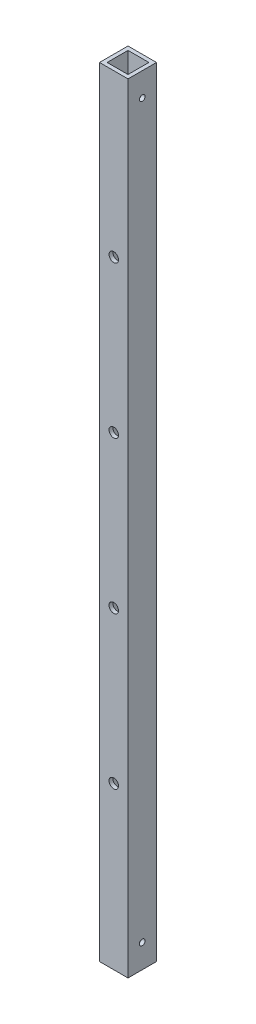
ISO-10303-21;
HEADER;
FILE_DESCRIPTION(('STEP AP214'),'2;1');
FILE_NAME('part.step','',(''),(''),'','','');
FILE_SCHEMA(('AUTOMOTIVE_DESIGN { 1 0 10303 214 1 1 1 1 }'));
ENDSEC;
DATA;
#1=APPLICATION_CONTEXT('core data for automotive mechanical design processes');
#2=APPLICATION_PROTOCOL_DEFINITION('international standard','automotive_design',2000,#1);
#3=PRODUCT_CONTEXT('',#1,'mechanical');
#4=PRODUCT('Part','Part','',(#3));
#5=PRODUCT_RELATED_PRODUCT_CATEGORY('part','',(#4));
#6=PRODUCT_DEFINITION_FORMATION('','',#4);
#7=PRODUCT_DEFINITION_CONTEXT('part definition',#1,'design');
#8=PRODUCT_DEFINITION('design','',#6,#7);
#9=PRODUCT_DEFINITION_SHAPE('','',#8);
#10=(LENGTH_UNIT() NAMED_UNIT(*) SI_UNIT(.MILLI.,.METRE.));
#11=(NAMED_UNIT(*) PLANE_ANGLE_UNIT() SI_UNIT($,.RADIAN.));
#12=(NAMED_UNIT(*) SI_UNIT($,.STERADIAN.) SOLID_ANGLE_UNIT());
#13=UNCERTAINTY_MEASURE_WITH_UNIT(LENGTH_MEASURE(1.E-05),#10,'distance_accuracy_value','');
#14=(GEOMETRIC_REPRESENTATION_CONTEXT(3) GLOBAL_UNCERTAINTY_ASSIGNED_CONTEXT((#13)) GLOBAL_UNIT_ASSIGNED_CONTEXT((#10,
#11,#12)) REPRESENTATION_CONTEXT('',''));
#15=CARTESIAN_POINT('',(0.,0.,0.));
#16=DIRECTION('',(0.,0.,1.));
#17=DIRECTION('',(1.,0.,0.));
#18=AXIS2_PLACEMENT_3D('',#15,#16,#17);
#19=CARTESIAN_POINT('',(7.5,410.,-7.5));
#20=DIRECTION('',(-1.,0.,0.));
#21=DIRECTION('',(0.,0.,1.));
#22=AXIS2_PLACEMENT_3D('',#19,#20,#21);
#23=PLANE('',#22);
#24=CARTESIAN_POINT('',(7.5,12.5,0.));
#25=DIRECTION('',(-1.,0.,0.));
#26=DIRECTION('',(0.,0.,1.));
#27=AXIS2_PLACEMENT_3D('',#24,#25,#26);
#28=CIRCLE('',#27,1.5);
#29=CARTESIAN_POINT('',(7.5,12.5,1.5));
#30=VERTEX_POINT('',#29);
#31=EDGE_CURVE('E184',#30,#30,#28,.T.);
#32=ORIENTED_EDGE('',*,*,#31,.T.);
#33=EDGE_LOOP('',(#32));
#34=FACE_BOUND('',#33,.T.);
#35=CARTESIAN_POINT('',(7.5,397.5,0.));
#36=DIRECTION('',(-1.,0.,0.));
#37=DIRECTION('',(0.,0.,1.));
#38=AXIS2_PLACEMENT_3D('',#35,#36,#37);
#39=CIRCLE('',#38,1.5);
#40=CARTESIAN_POINT('',(7.5,397.5,1.5));
#41=VERTEX_POINT('',#40);
#42=EDGE_CURVE('E195',#41,#41,#39,.T.);
#43=ORIENTED_EDGE('',*,*,#42,.T.);
#44=EDGE_LOOP('',(#43));
#45=FACE_BOUND('',#44,.T.);
#46=DIRECTION('',(0.,0.,-1.));
#47=VECTOR('',#46,1.);
#48=CARTESIAN_POINT('',(7.5,0.,-7.5));
#49=LINE('',#48,#47);
#50=CARTESIAN_POINT('',(7.5,0.,7.5));
#51=VERTEX_POINT('',#50);
#52=CARTESIAN_POINT('',(7.5,0.,-7.5));
#53=VERTEX_POINT('',#52);
#54=EDGE_CURVE('E137',#51,#53,#49,.T.);
#55=ORIENTED_EDGE('',*,*,#54,.T.);
#56=DIRECTION('',(0.,-1.,0.));
#57=VECTOR('',#56,1.);
#58=CARTESIAN_POINT('',(7.5,410.,-7.5));
#59=LINE('',#58,#57);
#60=CARTESIAN_POINT('',(7.5,410.,-7.5));
#61=VERTEX_POINT('',#60);
#62=EDGE_CURVE('E11',#61,#53,#59,.T.);
#63=ORIENTED_EDGE('',*,*,#62,.F.);
#64=DIRECTION('',(0.,0.,-1.));
#65=VECTOR('',#64,1.);
#66=CARTESIAN_POINT('',(7.5,410.,-7.5));
#67=LINE('',#66,#65);
#68=CARTESIAN_POINT('',(7.5,410.,7.5));
#69=VERTEX_POINT('',#68);
#70=EDGE_CURVE('E141',#69,#61,#67,.T.);
#71=ORIENTED_EDGE('',*,*,#70,.F.);
#72=DIRECTION('',(0.,-1.,0.));
#73=VECTOR('',#72,1.);
#74=CARTESIAN_POINT('',(7.5,410.,7.5));
#75=LINE('',#74,#73);
#76=EDGE_CURVE('E151',#69,#51,#75,.T.);
#77=ORIENTED_EDGE('',*,*,#76,.T.);
#78=EDGE_LOOP('',(#55,#63,#71,#77));
#79=FACE_BOUND('',#78,.T.);
#80=ADVANCED_FACE('F35',(#34,#45,#79),#23,.F.);
#81=CARTESIAN_POINT('',(-7.5,410.,-7.5));
#82=DIRECTION('',(0.,0.,1.));
#83=DIRECTION('',(1.,0.,0.));
#84=AXIS2_PLACEMENT_3D('',#81,#82,#83);
#85=PLANE('',#84);
#86=CARTESIAN_POINT('',(0.,85.,-7.5));
#87=DIRECTION('',(0.,0.,1.));
#88=DIRECTION('',(1.,0.,0.));
#89=AXIS2_PLACEMENT_3D('',#86,#87,#88);
#90=CIRCLE('',#89,2.5);
#91=CARTESIAN_POINT('',(2.5,85.,-7.5));
#92=VERTEX_POINT('',#91);
#93=EDGE_CURVE('E170',#92,#92,#90,.T.);
#94=ORIENTED_EDGE('',*,*,#93,.T.);
#95=EDGE_LOOP('',(#94));
#96=FACE_BOUND('',#95,.T.);
#97=CARTESIAN_POINT('',(0.,165.,-7.5));
#98=DIRECTION('',(0.,0.,1.));
#99=DIRECTION('',(1.,0.,0.));
#100=AXIS2_PLACEMENT_3D('',#97,#98,#99);
#101=CIRCLE('',#100,2.5);
#102=CARTESIAN_POINT('',(2.5,165.,-7.5));
#103=VERTEX_POINT('',#102);
#104=EDGE_CURVE('E212',#103,#103,#101,.T.);
#105=ORIENTED_EDGE('',*,*,#104,.T.);
#106=EDGE_LOOP('',(#105));
#107=FACE_BOUND('',#106,.T.);
#108=CARTESIAN_POINT('',(0.,245.,-7.5));
#109=DIRECTION('',(0.,0.,1.));
#110=DIRECTION('',(1.,0.,0.));
#111=AXIS2_PLACEMENT_3D('',#108,#109,#110);
#112=CIRCLE('',#111,2.50000000000001);
#113=CARTESIAN_POINT('',(2.50000000000001,245.,-7.5));
#114=VERTEX_POINT('',#113);
#115=EDGE_CURVE('E218',#114,#114,#112,.T.);
#116=ORIENTED_EDGE('',*,*,#115,.T.);
#117=EDGE_LOOP('',(#116));
#118=FACE_BOUND('',#117,.T.);
#119=CARTESIAN_POINT('',(0.,325.,-7.5));
#120=DIRECTION('',(0.,0.,1.));
#121=DIRECTION('',(1.,0.,0.));
#122=AXIS2_PLACEMENT_3D('',#119,#120,#121);
#123=CIRCLE('',#122,2.5);
#124=CARTESIAN_POINT('',(2.5,325.,-7.5));
#125=VERTEX_POINT('',#124);
#126=EDGE_CURVE('E224',#125,#125,#123,.T.);
#127=ORIENTED_EDGE('',*,*,#126,.T.);
#128=EDGE_LOOP('',(#127));
#129=FACE_BOUND('',#128,.T.);
#130=DIRECTION('',(-1.,0.,0.));
#131=VECTOR('',#130,1.);
#132=CARTESIAN_POINT('',(-7.5,0.,-7.5));
#133=LINE('',#132,#131);
#134=CARTESIAN_POINT('',(-7.5,0.,-7.5));
#135=VERTEX_POINT('',#134);
#136=EDGE_CURVE('E154',#53,#135,#133,.T.);
#137=ORIENTED_EDGE('',*,*,#136,.T.);
#138=DIRECTION('',(0.,-1.,0.));
#139=VECTOR('',#138,1.);
#140=CARTESIAN_POINT('',(-7.5,410.,-7.5));
#141=LINE('',#140,#139);
#142=CARTESIAN_POINT('',(-7.5,410.,-7.5));
#143=VERTEX_POINT('',#142);
#144=EDGE_CURVE('E43',#143,#135,#141,.T.);
#145=ORIENTED_EDGE('',*,*,#144,.F.);
#146=DIRECTION('',(-1.,0.,0.));
#147=VECTOR('',#146,1.);
#148=CARTESIAN_POINT('',(-7.5,410.,-7.5));
#149=LINE('',#148,#147);
#150=EDGE_CURVE('E144',#61,#143,#149,.T.);
#151=ORIENTED_EDGE('',*,*,#150,.F.);
#152=ORIENTED_EDGE('',*,*,#62,.T.);
#153=EDGE_LOOP('',(#137,#145,#151,#152));
#154=FACE_BOUND('',#153,.T.);
#155=ADVANCED_FACE('F260',(#96,#107,#118,#129,#154),#85,.F.);
#156=CARTESIAN_POINT('',(-7.5,410.,-7.5));
#157=DIRECTION('',(1.,0.,0.));
#158=DIRECTION('',(0.,0.,-1.));
#159=AXIS2_PLACEMENT_3D('',#156,#157,#158);
#160=PLANE('',#159);
#161=CARTESIAN_POINT('',(-7.5,12.5,0.));
#162=DIRECTION('',(-1.,0.,0.));
#163=DIRECTION('',(0.,0.,1.));
#164=AXIS2_PLACEMENT_3D('',#161,#162,#163);
#165=CIRCLE('',#164,1.5);
#166=CARTESIAN_POINT('',(-7.5,12.5,1.5));
#167=VERTEX_POINT('',#166);
#168=EDGE_CURVE('E190',#167,#167,#165,.T.);
#169=ORIENTED_EDGE('',*,*,#168,.F.);
#170=EDGE_LOOP('',(#169));
#171=FACE_BOUND('',#170,.T.);
#172=CARTESIAN_POINT('',(-7.5,397.5,0.));
#173=DIRECTION('',(-1.,0.,0.));
#174=DIRECTION('',(0.,0.,1.));
#175=AXIS2_PLACEMENT_3D('',#172,#173,#174);
#176=CIRCLE('',#175,1.5);
#177=CARTESIAN_POINT('',(-7.5,397.5,1.5));
#178=VERTEX_POINT('',#177);
#179=EDGE_CURVE('E200',#178,#178,#176,.T.);
#180=ORIENTED_EDGE('',*,*,#179,.F.);
#181=EDGE_LOOP('',(#180));
#182=FACE_BOUND('',#181,.T.);
#183=DIRECTION('',(0.,0.,1.));
#184=VECTOR('',#183,1.);
#185=CARTESIAN_POINT('',(-7.5,0.,-7.5));
#186=LINE('',#185,#184);
#187=CARTESIAN_POINT('',(-7.5,0.,7.5));
#188=VERTEX_POINT('',#187);
#189=EDGE_CURVE('E156',#135,#188,#186,.T.);
#190=ORIENTED_EDGE('',*,*,#189,.T.);
#191=DIRECTION('',(0.,-1.,0.));
#192=VECTOR('',#191,1.);
#193=CARTESIAN_POINT('',(-7.5,410.,7.5));
#194=LINE('',#193,#192);
#195=CARTESIAN_POINT('',(-7.5,410.,7.5));
#196=VERTEX_POINT('',#195);
#197=EDGE_CURVE('E161',#196,#188,#194,.T.);
#198=ORIENTED_EDGE('',*,*,#197,.F.);
#199=DIRECTION('',(0.,0.,1.));
#200=VECTOR('',#199,1.);
#201=CARTESIAN_POINT('',(-7.5,410.,-7.5));
#202=LINE('',#201,#200);
#203=EDGE_CURVE('E147',#143,#196,#202,.T.);
#204=ORIENTED_EDGE('',*,*,#203,.F.);
#205=ORIENTED_EDGE('',*,*,#144,.T.);
#206=EDGE_LOOP('',(#190,#198,#204,#205));
#207=FACE_BOUND('',#206,.T.);
#208=ADVANCED_FACE('F266',(#171,#182,#207),#160,.F.);
#209=CARTESIAN_POINT('',(-7.5,410.,7.5));
#210=DIRECTION('',(0.,0.,-1.));
#211=DIRECTION('',(-1.,0.,0.));
#212=AXIS2_PLACEMENT_3D('',#209,#210,#211);
#213=PLANE('',#212);
#214=CARTESIAN_POINT('',(0.,85.,7.5));
#215=DIRECTION('',(0.,0.,1.));
#216=DIRECTION('',(1.,0.,0.));
#217=AXIS2_PLACEMENT_3D('',#214,#215,#216);
#218=CIRCLE('',#217,2.5);
#219=CARTESIAN_POINT('',(2.5,85.,7.5));
#220=VERTEX_POINT('',#219);
#221=EDGE_CURVE('E209',#220,#220,#218,.T.);
#222=ORIENTED_EDGE('',*,*,#221,.F.);
#223=EDGE_LOOP('',(#222));
#224=FACE_BOUND('',#223,.T.);
#225=CARTESIAN_POINT('',(0.,165.,7.5));
#226=DIRECTION('',(0.,0.,1.));
#227=DIRECTION('',(1.,0.,0.));
#228=AXIS2_PLACEMENT_3D('',#225,#226,#227);
#229=CIRCLE('',#228,2.5);
#230=CARTESIAN_POINT('',(2.5,165.,7.5));
#231=VERTEX_POINT('',#230);
#232=EDGE_CURVE('E215',#231,#231,#229,.T.);
#233=ORIENTED_EDGE('',*,*,#232,.F.);
#234=EDGE_LOOP('',(#233));
#235=FACE_BOUND('',#234,.T.);
#236=CARTESIAN_POINT('',(0.,245.,7.5));
#237=DIRECTION('',(0.,0.,1.));
#238=DIRECTION('',(1.,0.,0.));
#239=AXIS2_PLACEMENT_3D('',#236,#237,#238);
#240=CIRCLE('',#239,2.50000000000001);
#241=CARTESIAN_POINT('',(2.50000000000001,245.,7.5));
#242=VERTEX_POINT('',#241);
#243=EDGE_CURVE('E221',#242,#242,#240,.T.);
#244=ORIENTED_EDGE('',*,*,#243,.F.);
#245=EDGE_LOOP('',(#244));
#246=FACE_BOUND('',#245,.T.);
#247=CARTESIAN_POINT('',(0.,325.,7.5));
#248=DIRECTION('',(0.,0.,1.));
#249=DIRECTION('',(1.,0.,0.));
#250=AXIS2_PLACEMENT_3D('',#247,#248,#249);
#251=CIRCLE('',#250,2.5);
#252=CARTESIAN_POINT('',(2.5,325.,7.5));
#253=VERTEX_POINT('',#252);
#254=EDGE_CURVE('E206',#253,#253,#251,.T.);
#255=ORIENTED_EDGE('',*,*,#254,.F.);
#256=EDGE_LOOP('',(#255));
#257=FACE_BOUND('',#256,.T.);
#258=DIRECTION('',(1.,0.,0.));
#259=VECTOR('',#258,1.);
#260=CARTESIAN_POINT('',(-7.5,0.,7.5));
#261=LINE('',#260,#259);
#262=EDGE_CURVE('E145',#188,#51,#261,.T.);
#263=ORIENTED_EDGE('',*,*,#262,.T.);
#264=ORIENTED_EDGE('',*,*,#76,.F.);
#265=DIRECTION('',(1.,0.,0.));
#266=VECTOR('',#265,1.);
#267=CARTESIAN_POINT('',(-7.5,410.,7.5));
#268=LINE('',#267,#266);
#269=EDGE_CURVE('E149',#196,#69,#268,.T.);
#270=ORIENTED_EDGE('',*,*,#269,.F.);
#271=ORIENTED_EDGE('',*,*,#197,.T.);
#272=EDGE_LOOP('',(#263,#264,#270,#271));
#273=FACE_BOUND('',#272,.T.);
#274=ADVANCED_FACE('F285',(#224,#235,#246,#257,#273),#213,.F.);
#275=CARTESIAN_POINT('',(0.,410.,0.));
#276=DIRECTION('',(0.,1.,0.));
#277=DIRECTION('',(0.,0.,1.));
#278=AXIS2_PLACEMENT_3D('',#275,#276,#277);
#279=PLANE('',#278);
#280=DIRECTION('',(0.,0.,-1.));
#281=VECTOR('',#280,1.);
#282=CARTESIAN_POINT('',(5.5,410.,-5.5));
#283=LINE('',#282,#281);
#284=CARTESIAN_POINT('',(5.5,410.,5.5));
#285=VERTEX_POINT('',#284);
#286=CARTESIAN_POINT('',(5.5,410.,-5.5));
#287=VERTEX_POINT('',#286);
#288=EDGE_CURVE('E51',#285,#287,#283,.T.);
#289=ORIENTED_EDGE('',*,*,#288,.F.);
#290=DIRECTION('',(1.,0.,0.));
#291=VECTOR('',#290,1.);
#292=CARTESIAN_POINT('',(-5.5,410.,5.5));
#293=LINE('',#292,#291);
#294=CARTESIAN_POINT('',(-5.5,410.,5.5));
#295=VERTEX_POINT('',#294);
#296=EDGE_CURVE('E119',#295,#285,#293,.T.);
#297=ORIENTED_EDGE('',*,*,#296,.F.);
#298=DIRECTION('',(0.,0.,1.));
#299=VECTOR('',#298,1.);
#300=CARTESIAN_POINT('',(-5.5,410.,-5.5));
#301=LINE('',#300,#299);
#302=CARTESIAN_POINT('',(-5.5,410.,-5.5));
#303=VERTEX_POINT('',#302);
#304=EDGE_CURVE('E122',#303,#295,#301,.T.);
#305=ORIENTED_EDGE('',*,*,#304,.F.);
#306=DIRECTION('',(-1.,0.,0.));
#307=VECTOR('',#306,1.);
#308=CARTESIAN_POINT('',(-5.5,410.,-5.5));
#309=LINE('',#308,#307);
#310=EDGE_CURVE('E131',#287,#303,#309,.T.);
#311=ORIENTED_EDGE('',*,*,#310,.F.);
#312=EDGE_LOOP('',(#289,#297,#305,#311));
#313=FACE_BOUND('',#312,.T.);
#314=ORIENTED_EDGE('',*,*,#70,.T.);
#315=ORIENTED_EDGE('',*,*,#150,.T.);
#316=ORIENTED_EDGE('',*,*,#203,.T.);
#317=ORIENTED_EDGE('',*,*,#269,.T.);
#318=EDGE_LOOP('',(#314,#315,#316,#317));
#319=FACE_BOUND('',#318,.T.);
#320=ADVANCED_FACE('F281',(#313,#319),#279,.T.);
#321=CARTESIAN_POINT('',(0.,0.,0.));
#322=DIRECTION('',(0.,1.,0.));
#323=DIRECTION('',(0.,0.,1.));
#324=AXIS2_PLACEMENT_3D('',#321,#322,#323);
#325=PLANE('',#324);
#326=DIRECTION('',(1.,0.,0.));
#327=VECTOR('',#326,1.);
#328=CARTESIAN_POINT('',(-5.5,0.,5.5));
#329=LINE('',#328,#327);
#330=CARTESIAN_POINT('',(-5.5,0.,5.5));
#331=VERTEX_POINT('',#330);
#332=CARTESIAN_POINT('',(5.5,0.,5.5));
#333=VERTEX_POINT('',#332);
#334=EDGE_CURVE('E109',#331,#333,#329,.T.);
#335=ORIENTED_EDGE('',*,*,#334,.T.);
#336=DIRECTION('',(0.,0.,-1.));
#337=VECTOR('',#336,1.);
#338=CARTESIAN_POINT('',(5.5,0.,-5.5));
#339=LINE('',#338,#337);
#340=CARTESIAN_POINT('',(5.5,0.,-5.5));
#341=VERTEX_POINT('',#340);
#342=EDGE_CURVE('E103',#333,#341,#339,.T.);
#343=ORIENTED_EDGE('',*,*,#342,.T.);
#344=DIRECTION('',(-1.,0.,0.));
#345=VECTOR('',#344,1.);
#346=CARTESIAN_POINT('',(-5.5,0.,-5.5));
#347=LINE('',#346,#345);
#348=CARTESIAN_POINT('',(-5.5,0.,-5.5));
#349=VERTEX_POINT('',#348);
#350=EDGE_CURVE('E112',#341,#349,#347,.T.);
#351=ORIENTED_EDGE('',*,*,#350,.T.);
#352=DIRECTION('',(0.,0.,1.));
#353=VECTOR('',#352,1.);
#354=CARTESIAN_POINT('',(-5.5,0.,-5.5));
#355=LINE('',#354,#353);
#356=EDGE_CURVE('E59',#349,#331,#355,.T.);
#357=ORIENTED_EDGE('',*,*,#356,.T.);
#358=EDGE_LOOP('',(#335,#343,#351,#357));
#359=FACE_BOUND('',#358,.T.);
#360=ORIENTED_EDGE('',*,*,#54,.F.);
#361=ORIENTED_EDGE('',*,*,#262,.F.);
#362=ORIENTED_EDGE('',*,*,#189,.F.);
#363=ORIENTED_EDGE('',*,*,#136,.F.);
#364=EDGE_LOOP('',(#360,#361,#362,#363));
#365=FACE_BOUND('',#364,.T.);
#366=ADVANCED_FACE('F116',(#359,#365),#325,.F.);
#367=CARTESIAN_POINT('',(5.5,0.,-5.5));
#368=DIRECTION('',(1.,0.,0.));
#369=DIRECTION('',(0.,0.,-1.));
#370=AXIS2_PLACEMENT_3D('',#367,#368,#369);
#371=PLANE('',#370);
#372=CARTESIAN_POINT('',(5.5,12.5,0.));
#373=DIRECTION('',(1.,0.,0.));
#374=DIRECTION('',(0.,0.,-1.));
#375=AXIS2_PLACEMENT_3D('',#372,#373,#374);
#376=CIRCLE('',#375,1.5);
#377=CARTESIAN_POINT('',(5.5,12.5,-1.5));
#378=VERTEX_POINT('',#377);
#379=EDGE_CURVE('E203',#378,#378,#376,.T.);
#380=ORIENTED_EDGE('',*,*,#379,.T.);
#381=EDGE_LOOP('',(#380));
#382=FACE_BOUND('',#381,.T.);
#383=CARTESIAN_POINT('',(5.5,397.5,0.));
#384=DIRECTION('',(1.,0.,0.));
#385=DIRECTION('',(0.,0.,-1.));
#386=AXIS2_PLACEMENT_3D('',#383,#384,#385);
#387=CIRCLE('',#386,1.5);
#388=CARTESIAN_POINT('',(5.5,397.5,-1.5));
#389=VERTEX_POINT('',#388);
#390=EDGE_CURVE('E183',#389,#389,#387,.T.);
#391=ORIENTED_EDGE('',*,*,#390,.T.);
#392=EDGE_LOOP('',(#391));
#393=FACE_BOUND('',#392,.T.);
#394=ORIENTED_EDGE('',*,*,#288,.T.);
#395=DIRECTION('',(0.,1.,0.));
#396=VECTOR('',#395,1.);
#397=CARTESIAN_POINT('',(5.5,0.,-5.5));
#398=LINE('',#397,#396);
#399=EDGE_CURVE('E99',#341,#287,#398,.T.);
#400=ORIENTED_EDGE('',*,*,#399,.F.);
#401=ORIENTED_EDGE('',*,*,#342,.F.);
#402=DIRECTION('',(0.,1.,0.));
#403=VECTOR('',#402,1.);
#404=CARTESIAN_POINT('',(5.5,0.,5.5));
#405=LINE('',#404,#403);
#406=EDGE_CURVE('E135',#333,#285,#405,.T.);
#407=ORIENTED_EDGE('',*,*,#406,.T.);
#408=EDGE_LOOP('',(#394,#400,#401,#407));
#409=FACE_BOUND('',#408,.T.);
#410=ADVANCED_FACE('F101',(#382,#393,#409),#371,.F.);
#411=CARTESIAN_POINT('',(-5.5,0.,5.5));
#412=DIRECTION('',(0.,0.,1.));
#413=DIRECTION('',(1.,0.,0.));
#414=AXIS2_PLACEMENT_3D('',#411,#412,#413);
#415=PLANE('',#414);
#416=CARTESIAN_POINT('',(0.,85.,5.5));
#417=DIRECTION('',(0.,0.,1.));
#418=DIRECTION('',(1.,0.,0.));
#419=AXIS2_PLACEMENT_3D('',#416,#417,#418);
#420=CIRCLE('',#419,2.5);
#421=CARTESIAN_POINT('',(2.5,85.,5.5));
#422=VERTEX_POINT('',#421);
#423=EDGE_CURVE('E125',#422,#422,#420,.T.);
#424=ORIENTED_EDGE('',*,*,#423,.T.);
#425=EDGE_LOOP('',(#424));
#426=FACE_BOUND('',#425,.T.);
#427=CARTESIAN_POINT('',(0.,165.,5.5));
#428=DIRECTION('',(0.,0.,1.));
#429=DIRECTION('',(1.,0.,0.));
#430=AXIS2_PLACEMENT_3D('',#427,#428,#429);
#431=CIRCLE('',#430,2.5);
#432=CARTESIAN_POINT('',(2.5,165.,5.5));
#433=VERTEX_POINT('',#432);
#434=EDGE_CURVE('E178',#433,#433,#431,.T.);
#435=ORIENTED_EDGE('',*,*,#434,.T.);
#436=EDGE_LOOP('',(#435));
#437=FACE_BOUND('',#436,.T.);
#438=CARTESIAN_POINT('',(0.,245.,5.5));
#439=DIRECTION('',(0.,0.,1.));
#440=DIRECTION('',(1.,0.,0.));
#441=AXIS2_PLACEMENT_3D('',#438,#439,#440);
#442=CIRCLE('',#441,2.50000000000001);
#443=CARTESIAN_POINT('',(2.50000000000001,245.,5.5));
#444=VERTEX_POINT('',#443);
#445=EDGE_CURVE('E174',#444,#444,#442,.T.);
#446=ORIENTED_EDGE('',*,*,#445,.T.);
#447=EDGE_LOOP('',(#446));
#448=FACE_BOUND('',#447,.T.);
#449=CARTESIAN_POINT('',(0.,325.,5.5));
#450=DIRECTION('',(0.,0.,1.));
#451=DIRECTION('',(1.,0.,0.));
#452=AXIS2_PLACEMENT_3D('',#449,#450,#451);
#453=CIRCLE('',#452,2.5);
#454=CARTESIAN_POINT('',(2.5,325.,5.5));
#455=VERTEX_POINT('',#454);
#456=EDGE_CURVE('E169',#455,#455,#453,.T.);
#457=ORIENTED_EDGE('',*,*,#456,.T.);
#458=EDGE_LOOP('',(#457));
#459=FACE_BOUND('',#458,.T.);
#460=ORIENTED_EDGE('',*,*,#296,.T.);
#461=ORIENTED_EDGE('',*,*,#406,.F.);
#462=ORIENTED_EDGE('',*,*,#334,.F.);
#463=DIRECTION('',(0.,1.,0.));
#464=VECTOR('',#463,1.);
#465=CARTESIAN_POINT('',(-5.5,0.,5.5));
#466=LINE('',#465,#464);
#467=EDGE_CURVE('E138',#331,#295,#466,.T.);
#468=ORIENTED_EDGE('',*,*,#467,.T.);
#469=EDGE_LOOP('',(#460,#461,#462,#468));
#470=FACE_BOUND('',#469,.T.);
#471=ADVANCED_FACE('F235',(#426,#437,#448,#459,#470),#415,.F.);
#472=CARTESIAN_POINT('',(-5.5,0.,-5.5));
#473=DIRECTION('',(-1.,0.,0.));
#474=DIRECTION('',(0.,0.,1.));
#475=AXIS2_PLACEMENT_3D('',#472,#473,#474);
#476=PLANE('',#475);
#477=CARTESIAN_POINT('',(-5.5,12.5,0.));
#478=DIRECTION('',(-1.,0.,0.));
#479=DIRECTION('',(0.,0.,1.));
#480=AXIS2_PLACEMENT_3D('',#477,#478,#479);
#481=CIRCLE('',#480,1.5);
#482=CARTESIAN_POINT('',(-5.5,12.5,1.5));
#483=VERTEX_POINT('',#482);
#484=EDGE_CURVE('E38',#483,#483,#481,.T.);
#485=ORIENTED_EDGE('',*,*,#484,.T.);
#486=EDGE_LOOP('',(#485));
#487=FACE_BOUND('',#486,.T.);
#488=CARTESIAN_POINT('',(-5.5,397.5,0.));
#489=DIRECTION('',(-1.,0.,0.));
#490=DIRECTION('',(0.,0.,1.));
#491=AXIS2_PLACEMENT_3D('',#488,#489,#490);
#492=CIRCLE('',#491,1.5);
#493=CARTESIAN_POINT('',(-5.5,397.5,1.5));
#494=VERTEX_POINT('',#493);
#495=EDGE_CURVE('E181',#494,#494,#492,.T.);
#496=ORIENTED_EDGE('',*,*,#495,.T.);
#497=EDGE_LOOP('',(#496));
#498=FACE_BOUND('',#497,.T.);
#499=ORIENTED_EDGE('',*,*,#304,.T.);
#500=ORIENTED_EDGE('',*,*,#467,.F.);
#501=ORIENTED_EDGE('',*,*,#356,.F.);
#502=DIRECTION('',(0.,1.,0.));
#503=VECTOR('',#502,1.);
#504=CARTESIAN_POINT('',(-5.5,0.,-5.5));
#505=LINE('',#504,#503);
#506=EDGE_CURVE('E108',#349,#303,#505,.T.);
#507=ORIENTED_EDGE('',*,*,#506,.T.);
#508=EDGE_LOOP('',(#499,#500,#501,#507));
#509=FACE_BOUND('',#508,.T.);
#510=ADVANCED_FACE('F308',(#487,#498,#509),#476,.F.);
#511=CARTESIAN_POINT('',(-5.5,0.,-5.5));
#512=DIRECTION('',(0.,0.,-1.));
#513=DIRECTION('',(-1.,0.,0.));
#514=AXIS2_PLACEMENT_3D('',#511,#512,#513);
#515=PLANE('',#514);
#516=CARTESIAN_POINT('',(0.,85.,-5.5));
#517=DIRECTION('',(0.,0.,-1.));
#518=DIRECTION('',(-1.,0.,0.));
#519=AXIS2_PLACEMENT_3D('',#516,#517,#518);
#520=CIRCLE('',#519,2.5);
#521=CARTESIAN_POINT('',(-2.5,85.,-5.5));
#522=VERTEX_POINT('',#521);
#523=EDGE_CURVE('E179',#522,#522,#520,.T.);
#524=ORIENTED_EDGE('',*,*,#523,.T.);
#525=EDGE_LOOP('',(#524));
#526=FACE_BOUND('',#525,.T.);
#527=CARTESIAN_POINT('',(0.,165.,-5.5));
#528=DIRECTION('',(0.,0.,-1.));
#529=DIRECTION('',(-1.,0.,0.));
#530=AXIS2_PLACEMENT_3D('',#527,#528,#529);
#531=CIRCLE('',#530,2.5);
#532=CARTESIAN_POINT('',(-2.5,165.,-5.5));
#533=VERTEX_POINT('',#532);
#534=EDGE_CURVE('E175',#533,#533,#531,.T.);
#535=ORIENTED_EDGE('',*,*,#534,.T.);
#536=EDGE_LOOP('',(#535));
#537=FACE_BOUND('',#536,.T.);
#538=CARTESIAN_POINT('',(0.,245.,-5.5));
#539=DIRECTION('',(0.,0.,-1.));
#540=DIRECTION('',(-1.,0.,0.));
#541=AXIS2_PLACEMENT_3D('',#538,#539,#540);
#542=CIRCLE('',#541,2.50000000000001);
#543=CARTESIAN_POINT('',(-2.50000000000001,245.,-5.5));
#544=VERTEX_POINT('',#543);
#545=EDGE_CURVE('E171',#544,#544,#542,.T.);
#546=ORIENTED_EDGE('',*,*,#545,.T.);
#547=EDGE_LOOP('',(#546));
#548=FACE_BOUND('',#547,.T.);
#549=CARTESIAN_POINT('',(0.,325.,-5.5));
#550=DIRECTION('',(0.,0.,-1.));
#551=DIRECTION('',(-1.,0.,0.));
#552=AXIS2_PLACEMENT_3D('',#549,#550,#551);
#553=CIRCLE('',#552,2.5);
#554=CARTESIAN_POINT('',(-2.5,325.,-5.5));
#555=VERTEX_POINT('',#554);
#556=EDGE_CURVE('E166',#555,#555,#553,.T.);
#557=ORIENTED_EDGE('',*,*,#556,.T.);
#558=EDGE_LOOP('',(#557));
#559=FACE_BOUND('',#558,.T.);
#560=ORIENTED_EDGE('',*,*,#310,.T.);
#561=ORIENTED_EDGE('',*,*,#506,.F.);
#562=ORIENTED_EDGE('',*,*,#350,.F.);
#563=ORIENTED_EDGE('',*,*,#399,.T.);
#564=EDGE_LOOP('',(#560,#561,#562,#563));
#565=FACE_BOUND('',#564,.T.);
#566=ADVANCED_FACE('F113',(#526,#537,#548,#559,#565),#515,.F.);
#567=CARTESIAN_POINT('',(0.,325.,-7.5));
#568=DIRECTION('',(0.,0.,1.));
#569=DIRECTION('',(1.,0.,0.));
#570=AXIS2_PLACEMENT_3D('',#567,#568,#569);
#571=CYLINDRICAL_SURFACE('',#570,2.5);
#572=ORIENTED_EDGE('',*,*,#126,.F.);
#573=EDGE_LOOP('',(#572));
#574=FACE_BOUND('',#573,.T.);
#575=ORIENTED_EDGE('',*,*,#556,.F.);
#576=EDGE_LOOP('',(#575));
#577=FACE_BOUND('',#576,.T.);
#578=ADVANCED_FACE('F307',(#574,#577),#571,.F.);
#579=CARTESIAN_POINT('',(0.,245.,-7.5));
#580=DIRECTION('',(0.,0.,1.));
#581=DIRECTION('',(1.,0.,0.));
#582=AXIS2_PLACEMENT_3D('',#579,#580,#581);
#583=CYLINDRICAL_SURFACE('',#582,2.50000000000001);
#584=ORIENTED_EDGE('',*,*,#115,.F.);
#585=EDGE_LOOP('',(#584));
#586=FACE_BOUND('',#585,.T.);
#587=ORIENTED_EDGE('',*,*,#545,.F.);
#588=EDGE_LOOP('',(#587));
#589=FACE_BOUND('',#588,.T.);
#590=ADVANCED_FACE('F256',(#586,#589),#583,.F.);
#591=CARTESIAN_POINT('',(0.,165.,-7.5));
#592=DIRECTION('',(0.,0.,1.));
#593=DIRECTION('',(1.,0.,0.));
#594=AXIS2_PLACEMENT_3D('',#591,#592,#593);
#595=CYLINDRICAL_SURFACE('',#594,2.5);
#596=ORIENTED_EDGE('',*,*,#104,.F.);
#597=EDGE_LOOP('',(#596));
#598=FACE_BOUND('',#597,.T.);
#599=ORIENTED_EDGE('',*,*,#534,.F.);
#600=EDGE_LOOP('',(#599));
#601=FACE_BOUND('',#600,.T.);
#602=ADVANCED_FACE('F244',(#598,#601),#595,.F.);
#603=CARTESIAN_POINT('',(0.,85.,-7.5));
#604=DIRECTION('',(0.,0.,1.));
#605=DIRECTION('',(1.,0.,0.));
#606=AXIS2_PLACEMENT_3D('',#603,#604,#605);
#607=CYLINDRICAL_SURFACE('',#606,2.5);
#608=ORIENTED_EDGE('',*,*,#93,.F.);
#609=EDGE_LOOP('',(#608));
#610=FACE_BOUND('',#609,.T.);
#611=ORIENTED_EDGE('',*,*,#523,.F.);
#612=EDGE_LOOP('',(#611));
#613=FACE_BOUND('',#612,.T.);
#614=ADVANCED_FACE('F252',(#610,#613),#607,.F.);
#615=ORIENTED_EDGE('',*,*,#254,.T.);
#616=EDGE_LOOP('',(#615));
#617=FACE_BOUND('',#616,.T.);
#618=ORIENTED_EDGE('',*,*,#456,.F.);
#619=EDGE_LOOP('',(#618));
#620=FACE_BOUND('',#619,.T.);
#621=ADVANCED_FACE('F253',(#617,#620),#571,.F.);
#622=ORIENTED_EDGE('',*,*,#243,.T.);
#623=EDGE_LOOP('',(#622));
#624=FACE_BOUND('',#623,.T.);
#625=ORIENTED_EDGE('',*,*,#445,.F.);
#626=EDGE_LOOP('',(#625));
#627=FACE_BOUND('',#626,.T.);
#628=ADVANCED_FACE('F241',(#624,#627),#583,.F.);
#629=ORIENTED_EDGE('',*,*,#232,.T.);
#630=EDGE_LOOP('',(#629));
#631=FACE_BOUND('',#630,.T.);
#632=ORIENTED_EDGE('',*,*,#434,.F.);
#633=EDGE_LOOP('',(#632));
#634=FACE_BOUND('',#633,.T.);
#635=ADVANCED_FACE('F238',(#631,#634),#595,.F.);
#636=ORIENTED_EDGE('',*,*,#221,.T.);
#637=EDGE_LOOP('',(#636));
#638=FACE_BOUND('',#637,.T.);
#639=ORIENTED_EDGE('',*,*,#423,.F.);
#640=EDGE_LOOP('',(#639));
#641=FACE_BOUND('',#640,.T.);
#642=ADVANCED_FACE('F240',(#638,#641),#607,.F.);
#643=CARTESIAN_POINT('',(7.5,397.5,0.));
#644=DIRECTION('',(-1.,0.,0.));
#645=DIRECTION('',(0.,0.,1.));
#646=AXIS2_PLACEMENT_3D('',#643,#644,#645);
#647=CYLINDRICAL_SURFACE('',#646,1.5);
#648=ORIENTED_EDGE('',*,*,#179,.T.);
#649=EDGE_LOOP('',(#648));
#650=FACE_BOUND('',#649,.T.);
#651=ORIENTED_EDGE('',*,*,#495,.F.);
#652=EDGE_LOOP('',(#651));
#653=FACE_BOUND('',#652,.T.);
#654=ADVANCED_FACE('F249',(#650,#653),#647,.F.);
#655=CARTESIAN_POINT('',(7.5,12.5,0.));
#656=DIRECTION('',(-1.,0.,0.));
#657=DIRECTION('',(0.,0.,1.));
#658=AXIS2_PLACEMENT_3D('',#655,#656,#657);
#659=CYLINDRICAL_SURFACE('',#658,1.5);
#660=ORIENTED_EDGE('',*,*,#168,.T.);
#661=EDGE_LOOP('',(#660));
#662=FACE_BOUND('',#661,.T.);
#663=ORIENTED_EDGE('',*,*,#484,.F.);
#664=EDGE_LOOP('',(#663));
#665=FACE_BOUND('',#664,.T.);
#666=ADVANCED_FACE('F377',(#662,#665),#659,.F.);
#667=ORIENTED_EDGE('',*,*,#42,.F.);
#668=EDGE_LOOP('',(#667));
#669=FACE_BOUND('',#668,.T.);
#670=ORIENTED_EDGE('',*,*,#390,.F.);
#671=EDGE_LOOP('',(#670));
#672=FACE_BOUND('',#671,.T.);
#673=ADVANCED_FACE('F380',(#669,#672),#647,.F.);
#674=ORIENTED_EDGE('',*,*,#31,.F.);
#675=EDGE_LOOP('',(#674));
#676=FACE_BOUND('',#675,.T.);
#677=ORIENTED_EDGE('',*,*,#379,.F.);
#678=EDGE_LOOP('',(#677));
#679=FACE_BOUND('',#678,.T.);
#680=ADVANCED_FACE('F387',(#676,#679),#659,.F.);
#681=CLOSED_SHELL('',(#80,#155,#208,#274,#320,#366,#410,#471,#510,#566,#578,#590,#602,#614,#621,
#628,#635,#642,#654,#666,#673,#680));
#682=MANIFOLD_SOLID_BREP('B2',#681);
#683=ADVANCED_BREP_SHAPE_REPRESENTATION('',(#18,#682),#14);
#684=SHAPE_DEFINITION_REPRESENTATION(#9,#683);
ENDSEC;
END-ISO-10303-21;
